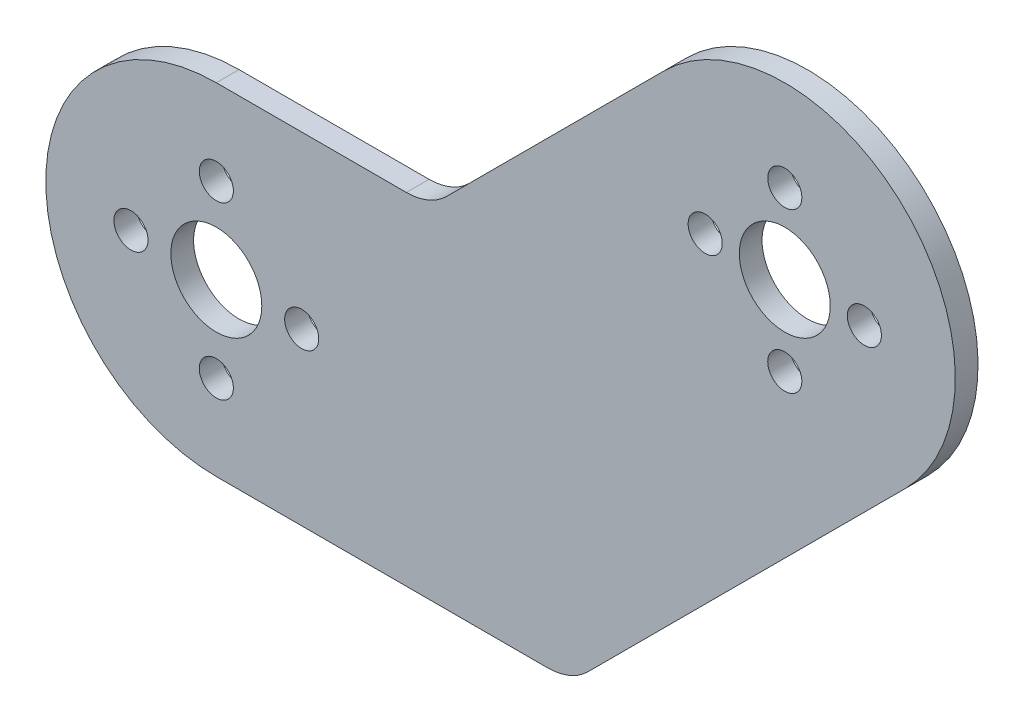
ISO-10303-21;
HEADER;
FILE_DESCRIPTION(('STEP AP214'),'2;1');
FILE_NAME('part.step','',(''),(''),'','','');
FILE_SCHEMA(('AUTOMOTIVE_DESIGN { 1 0 10303 214 1 1 1 1 }'));
ENDSEC;
DATA;
#1=APPLICATION_CONTEXT('core data for automotive mechanical design processes');
#2=APPLICATION_PROTOCOL_DEFINITION('international standard','automotive_design',2000,#1);
#3=PRODUCT_CONTEXT('',#1,'mechanical');
#4=PRODUCT('Part','Part','',(#3));
#5=PRODUCT_RELATED_PRODUCT_CATEGORY('part','',(#4));
#6=PRODUCT_DEFINITION_FORMATION('','',#4);
#7=PRODUCT_DEFINITION_CONTEXT('part definition',#1,'design');
#8=PRODUCT_DEFINITION('design','',#6,#7);
#9=PRODUCT_DEFINITION_SHAPE('','',#8);
#10=(LENGTH_UNIT() NAMED_UNIT(*) SI_UNIT(.MILLI.,.METRE.));
#11=(NAMED_UNIT(*) PLANE_ANGLE_UNIT() SI_UNIT($,.RADIAN.));
#12=(NAMED_UNIT(*) SI_UNIT($,.STERADIAN.) SOLID_ANGLE_UNIT());
#13=UNCERTAINTY_MEASURE_WITH_UNIT(LENGTH_MEASURE(1.E-05),#10,'distance_accuracy_value','');
#14=(GEOMETRIC_REPRESENTATION_CONTEXT(3) GLOBAL_UNCERTAINTY_ASSIGNED_CONTEXT((#13)) GLOBAL_UNIT_ASSIGNED_CONTEXT((#10,
#11,#12)) REPRESENTATION_CONTEXT('',''));
#15=CARTESIAN_POINT('',(0.,0.,0.));
#16=DIRECTION('',(0.,0.,1.));
#17=DIRECTION('',(1.,0.,0.));
#18=AXIS2_PLACEMENT_3D('',#15,#16,#17);
#19=CARTESIAN_POINT('',(0.,0.,2.));
#20=DIRECTION('',(0.,0.,1.));
#21=DIRECTION('',(1.,0.,0.));
#22=AXIS2_PLACEMENT_3D('',#19,#20,#21);
#23=PLANE('',#22);
#24=CARTESIAN_POINT('',(56.9999999995242,24.9999999995243,2.));
#25=DIRECTION('',(0.,0.,1.));
#26=DIRECTION('',(0.,-1.,0.));
#27=AXIS2_PLACEMENT_3D('',#24,#25,#26);
#28=CIRCLE('',#27,1.5);
#29=CARTESIAN_POINT('',(56.9999999995243,23.4999999995243,2.));
#30=VERTEX_POINT('',#29);
#31=EDGE_CURVE('E232',#30,#30,#28,.T.);
#32=ORIENTED_EDGE('',*,*,#31,.F.);
#33=EDGE_LOOP('',(#32));
#34=FACE_BOUND('',#33,.T.);
#35=CARTESIAN_POINT('',(49.9999999995242,17.9999999995242,2.));
#36=DIRECTION('',(0.,0.,1.));
#37=DIRECTION('',(-1.,0.,0.));
#38=AXIS2_PLACEMENT_3D('',#35,#36,#37);
#39=CIRCLE('',#38,1.5);
#40=CARTESIAN_POINT('',(48.4999999995242,17.9999999995242,2.));
#41=VERTEX_POINT('',#40);
#42=EDGE_CURVE('E226',#41,#41,#39,.T.);
#43=ORIENTED_EDGE('',*,*,#42,.F.);
#44=EDGE_LOOP('',(#43));
#45=FACE_BOUND('',#44,.T.);
#46=CARTESIAN_POINT('',(42.9999999995242,24.9999999995242,2.));
#47=DIRECTION('',(0.,0.,1.));
#48=DIRECTION('',(0.,1.,0.));
#49=AXIS2_PLACEMENT_3D('',#46,#47,#48);
#50=CIRCLE('',#49,1.5);
#51=CARTESIAN_POINT('',(42.9999999995242,26.4999999995242,2.));
#52=VERTEX_POINT('',#51);
#53=EDGE_CURVE('E220',#52,#52,#50,.T.);
#54=ORIENTED_EDGE('',*,*,#53,.F.);
#55=EDGE_LOOP('',(#54));
#56=FACE_BOUND('',#55,.T.);
#57=CARTESIAN_POINT('',(49.9999999995242,31.9999999995242,2.));
#58=DIRECTION('',(0.,0.,1.));
#59=DIRECTION('',(1.,0.,0.));
#60=AXIS2_PLACEMENT_3D('',#57,#58,#59);
#61=CIRCLE('',#60,1.5);
#62=CARTESIAN_POINT('',(51.4999999995242,31.9999999995242,2.));
#63=VERTEX_POINT('',#62);
#64=EDGE_CURVE('E214',#63,#63,#61,.T.);
#65=ORIENTED_EDGE('',*,*,#64,.F.);
#66=EDGE_LOOP('',(#65));
#67=FACE_BOUND('',#66,.T.);
#68=CARTESIAN_POINT('',(49.9999999995242,24.9999999995242,2.));
#69=DIRECTION('',(0.,0.,1.));
#70=DIRECTION('',(1.,0.,0.));
#71=AXIS2_PLACEMENT_3D('',#68,#69,#70);
#72=CIRCLE('',#71,3.99999999999999);
#73=CARTESIAN_POINT('',(53.9999999995242,24.9999999995242,2.));
#74=VERTEX_POINT('',#73);
#75=EDGE_CURVE('E208',#74,#74,#72,.T.);
#76=ORIENTED_EDGE('',*,*,#75,.F.);
#77=EDGE_LOOP('',(#76));
#78=FACE_BOUND('',#77,.T.);
#79=CARTESIAN_POINT('',(0.,-7.50979876784262,2.));
#80=DIRECTION('',(0.,0.,1.));
#81=DIRECTION('',(-1.,0.,0.));
#82=AXIS2_PLACEMENT_3D('',#79,#80,#81);
#83=CIRCLE('',#82,1.5);
#84=CARTESIAN_POINT('',(-1.5,-7.50979876784262,2.));
#85=VERTEX_POINT('',#84);
#86=EDGE_CURVE('E193',#85,#85,#83,.T.);
#87=ORIENTED_EDGE('',*,*,#86,.F.);
#88=EDGE_LOOP('',(#87));
#89=FACE_BOUND('',#88,.T.);
#90=CARTESIAN_POINT('',(0.,7.50979876784262,2.));
#91=DIRECTION('',(0.,0.,1.));
#92=DIRECTION('',(1.,0.,0.));
#93=AXIS2_PLACEMENT_3D('',#90,#91,#92);
#94=CIRCLE('',#93,1.5);
#95=CARTESIAN_POINT('',(1.5,7.50979876784262,2.));
#96=VERTEX_POINT('',#95);
#97=EDGE_CURVE('E181',#96,#96,#94,.T.);
#98=ORIENTED_EDGE('',*,*,#97,.F.);
#99=EDGE_LOOP('',(#98));
#100=FACE_BOUND('',#99,.T.);
#101=CARTESIAN_POINT('',(0.,0.,2.));
#102=DIRECTION('',(0.,0.,1.));
#103=DIRECTION('',(1.,0.,0.));
#104=AXIS2_PLACEMENT_3D('',#101,#102,#103);
#105=CIRCLE('',#104,15.);
#106=CARTESIAN_POINT('',(0.,15.,2.));
#107=VERTEX_POINT('',#106);
#108=CARTESIAN_POINT('',(0.,-15.,2.));
#109=VERTEX_POINT('',#108);
#110=EDGE_CURVE('E144',#107,#109,#105,.T.);
#111=ORIENTED_EDGE('',*,*,#110,.T.);
#112=DIRECTION('',(1.,0.,0.));
#113=VECTOR('',#112,1.);
#114=CARTESIAN_POINT('',(29.1421356237315,-15.0000000000001,2.));
#115=LINE('',#114,#113);
#116=CARTESIAN_POINT('',(29.1421356237315,-15.0000000000001,2.));
#117=VERTEX_POINT('',#116);
#118=EDGE_CURVE('E92',#109,#117,#115,.T.);
#119=ORIENTED_EDGE('',*,*,#118,.T.);
#120=CARTESIAN_POINT('',(29.1421356237316,-10.0000000000001,2.));
#121=DIRECTION('',(0.,0.,1.));
#122=DIRECTION('',(-1.,0.,0.));
#123=AXIS2_PLACEMENT_3D('',#120,#121,#122);
#124=CIRCLE('',#123,4.99999999999996);
#125=CARTESIAN_POINT('',(32.6776695296644,-13.5355339059327,2.));
#126=VERTEX_POINT('',#125);
#127=EDGE_CURVE('E159',#117,#126,#124,.T.);
#128=ORIENTED_EDGE('',*,*,#127,.T.);
#129=DIRECTION('',(0.707106781186539,0.707106781186556,0.));
#130=VECTOR('',#129,1.);
#131=CARTESIAN_POINT('',(60.6066017173227,14.3933982817263,2.));
#132=LINE('',#131,#130);
#133=CARTESIAN_POINT('',(60.6066017173227,14.3933982817263,2.));
#134=VERTEX_POINT('',#133);
#135=EDGE_CURVE('E172',#126,#134,#132,.T.);
#136=ORIENTED_EDGE('',*,*,#135,.T.);
#137=CARTESIAN_POINT('',(49.9999999995244,24.9999999995244,2.));
#138=DIRECTION('',(0.,0.,1.));
#139=DIRECTION('',(-1.,0.,0.));
#140=AXIS2_PLACEMENT_3D('',#137,#138,#139);
#141=CIRCLE('',#140,15.);
#142=CARTESIAN_POINT('',(39.393398281726,35.6066017173225,2.));
#143=VERTEX_POINT('',#142);
#144=EDGE_CURVE('E111',#134,#143,#141,.T.);
#145=ORIENTED_EDGE('',*,*,#144,.T.);
#146=DIRECTION('',(-0.707106781186539,-0.707106781186556,0.));
#147=VECTOR('',#146,1.);
#148=CARTESIAN_POINT('',(20.2512626584713,16.4644660940672,2.));
#149=LINE('',#148,#147);
#150=CARTESIAN_POINT('',(20.2512626584713,16.4644660940672,2.));
#151=VERTEX_POINT('',#150);
#152=EDGE_CURVE('E105',#143,#151,#149,.T.);
#153=ORIENTED_EDGE('',*,*,#152,.T.);
#154=CARTESIAN_POINT('',(16.7157287525385,19.9999999999999,2.));
#155=DIRECTION('',(0.,0.,-1.));
#156=DIRECTION('',(1.,0.,0.));
#157=AXIS2_PLACEMENT_3D('',#154,#155,#156);
#158=CIRCLE('',#157,5.);
#159=CARTESIAN_POINT('',(16.7157287525385,14.9999999999999,2.));
#160=VERTEX_POINT('',#159);
#161=EDGE_CURVE('E109',#151,#160,#158,.T.);
#162=ORIENTED_EDGE('',*,*,#161,.T.);
#163=DIRECTION('',(-1.,0.,0.));
#164=VECTOR('',#163,1.);
#165=CARTESIAN_POINT('',(0.,15.,2.));
#166=LINE('',#165,#164);
#167=EDGE_CURVE('E49',#160,#107,#166,.T.);
#168=ORIENTED_EDGE('',*,*,#167,.T.);
#169=EDGE_LOOP('',(#111,#119,#128,#136,#145,#153,#162,#168));
#170=FACE_BOUND('',#169,.T.);
#171=CARTESIAN_POINT('',(0.,0.,2.));
#172=DIRECTION('',(0.,0.,1.));
#173=DIRECTION('',(1.,0.,0.));
#174=AXIS2_PLACEMENT_3D('',#171,#172,#173);
#175=CIRCLE('',#174,4.);
#176=CARTESIAN_POINT('',(4.,0.,2.));
#177=VERTEX_POINT('',#176);
#178=EDGE_CURVE('E133',#177,#177,#175,.T.);
#179=ORIENTED_EDGE('',*,*,#178,.F.);
#180=EDGE_LOOP('',(#179));
#181=FACE_BOUND('',#180,.T.);
#182=CARTESIAN_POINT('',(-7.50979876784262,0.,2.));
#183=DIRECTION('',(0.,0.,1.));
#184=DIRECTION('',(0.,1.,0.));
#185=AXIS2_PLACEMENT_3D('',#182,#183,#184);
#186=CIRCLE('',#185,1.5);
#187=CARTESIAN_POINT('',(-7.50979876784262,1.49999999999997,2.));
#188=VERTEX_POINT('',#187);
#189=EDGE_CURVE('E187',#188,#188,#186,.T.);
#190=ORIENTED_EDGE('',*,*,#189,.F.);
#191=EDGE_LOOP('',(#190));
#192=FACE_BOUND('',#191,.T.);
#193=CARTESIAN_POINT('',(7.50979876784262,0.,2.));
#194=DIRECTION('',(0.,0.,1.));
#195=DIRECTION('',(0.,-1.,0.));
#196=AXIS2_PLACEMENT_3D('',#193,#194,#195);
#197=CIRCLE('',#196,1.5);
#198=CARTESIAN_POINT('',(7.50979876784263,-1.49999999999992,2.));
#199=VERTEX_POINT('',#198);
#200=EDGE_CURVE('E199',#199,#199,#197,.T.);
#201=ORIENTED_EDGE('',*,*,#200,.F.);
#202=EDGE_LOOP('',(#201));
#203=FACE_BOUND('',#202,.T.);
#204=ADVANCED_FACE('F32',(#34,#45,#56,#67,#78,#89,#100,#170,#181,#192,#203),#23,.T.);
#205=CARTESIAN_POINT('',(0.,0.,0.));
#206=DIRECTION('',(0.,0.,1.));
#207=DIRECTION('',(1.,0.,0.));
#208=AXIS2_PLACEMENT_3D('',#205,#206,#207);
#209=PLANE('',#208);
#210=CARTESIAN_POINT('',(56.9999999995242,24.9999999995243,0.));
#211=DIRECTION('',(0.,0.,1.));
#212=DIRECTION('',(0.,-1.,0.));
#213=AXIS2_PLACEMENT_3D('',#210,#211,#212);
#214=CIRCLE('',#213,1.5);
#215=CARTESIAN_POINT('',(56.9999999995243,23.4999999995243,0.));
#216=VERTEX_POINT('',#215);
#217=EDGE_CURVE('E229',#216,#216,#214,.T.);
#218=ORIENTED_EDGE('',*,*,#217,.T.);
#219=EDGE_LOOP('',(#218));
#220=FACE_BOUND('',#219,.T.);
#221=CARTESIAN_POINT('',(49.9999999995242,17.9999999995242,0.));
#222=DIRECTION('',(0.,0.,1.));
#223=DIRECTION('',(-1.,0.,0.));
#224=AXIS2_PLACEMENT_3D('',#221,#222,#223);
#225=CIRCLE('',#224,1.5);
#226=CARTESIAN_POINT('',(48.4999999995242,17.9999999995242,0.));
#227=VERTEX_POINT('',#226);
#228=EDGE_CURVE('E223',#227,#227,#225,.T.);
#229=ORIENTED_EDGE('',*,*,#228,.T.);
#230=EDGE_LOOP('',(#229));
#231=FACE_BOUND('',#230,.T.);
#232=CARTESIAN_POINT('',(42.9999999995242,24.9999999995242,0.));
#233=DIRECTION('',(0.,0.,1.));
#234=DIRECTION('',(0.,1.,0.));
#235=AXIS2_PLACEMENT_3D('',#232,#233,#234);
#236=CIRCLE('',#235,1.5);
#237=CARTESIAN_POINT('',(42.9999999995242,26.4999999995242,0.));
#238=VERTEX_POINT('',#237);
#239=EDGE_CURVE('E217',#238,#238,#236,.T.);
#240=ORIENTED_EDGE('',*,*,#239,.T.);
#241=EDGE_LOOP('',(#240));
#242=FACE_BOUND('',#241,.T.);
#243=CARTESIAN_POINT('',(49.9999999995242,31.9999999995242,0.));
#244=DIRECTION('',(0.,0.,1.));
#245=DIRECTION('',(1.,0.,0.));
#246=AXIS2_PLACEMENT_3D('',#243,#244,#245);
#247=CIRCLE('',#246,1.5);
#248=CARTESIAN_POINT('',(51.4999999995242,31.9999999995242,0.));
#249=VERTEX_POINT('',#248);
#250=EDGE_CURVE('E211',#249,#249,#247,.T.);
#251=ORIENTED_EDGE('',*,*,#250,.T.);
#252=EDGE_LOOP('',(#251));
#253=FACE_BOUND('',#252,.T.);
#254=CARTESIAN_POINT('',(49.9999999995242,24.9999999995242,0.));
#255=DIRECTION('',(0.,0.,1.));
#256=DIRECTION('',(1.,0.,0.));
#257=AXIS2_PLACEMENT_3D('',#254,#255,#256);
#258=CIRCLE('',#257,3.99999999999999);
#259=CARTESIAN_POINT('',(53.9999999995242,24.9999999995242,0.));
#260=VERTEX_POINT('',#259);
#261=EDGE_CURVE('E205',#260,#260,#258,.T.);
#262=ORIENTED_EDGE('',*,*,#261,.T.);
#263=EDGE_LOOP('',(#262));
#264=FACE_BOUND('',#263,.T.);
#265=CARTESIAN_POINT('',(0.,-7.50979876784262,0.));
#266=DIRECTION('',(0.,0.,1.));
#267=DIRECTION('',(-1.,0.,0.));
#268=AXIS2_PLACEMENT_3D('',#265,#266,#267);
#269=CIRCLE('',#268,1.5);
#270=CARTESIAN_POINT('',(-1.5,-7.50979876784262,0.));
#271=VERTEX_POINT('',#270);
#272=EDGE_CURVE('E196',#271,#271,#269,.T.);
#273=ORIENTED_EDGE('',*,*,#272,.T.);
#274=EDGE_LOOP('',(#273));
#275=FACE_BOUND('',#274,.T.);
#276=CARTESIAN_POINT('',(0.,7.50979876784262,0.));
#277=DIRECTION('',(0.,0.,1.));
#278=DIRECTION('',(1.,0.,0.));
#279=AXIS2_PLACEMENT_3D('',#276,#277,#278);
#280=CIRCLE('',#279,1.5);
#281=CARTESIAN_POINT('',(1.5,7.50979876784262,0.));
#282=VERTEX_POINT('',#281);
#283=EDGE_CURVE('E184',#282,#282,#280,.T.);
#284=ORIENTED_EDGE('',*,*,#283,.T.);
#285=EDGE_LOOP('',(#284));
#286=FACE_BOUND('',#285,.T.);
#287=CARTESIAN_POINT('',(0.,0.,0.));
#288=DIRECTION('',(0.,0.,1.));
#289=DIRECTION('',(1.,0.,0.));
#290=AXIS2_PLACEMENT_3D('',#287,#288,#289);
#291=CIRCLE('',#290,15.);
#292=CARTESIAN_POINT('',(0.,15.,0.));
#293=VERTEX_POINT('',#292);
#294=CARTESIAN_POINT('',(0.,-15.,0.));
#295=VERTEX_POINT('',#294);
#296=EDGE_CURVE('E129',#293,#295,#291,.T.);
#297=ORIENTED_EDGE('',*,*,#296,.F.);
#298=DIRECTION('',(-1.,0.,0.));
#299=VECTOR('',#298,1.);
#300=CARTESIAN_POINT('',(0.,15.,0.));
#301=LINE('',#300,#299);
#302=CARTESIAN_POINT('',(16.7157287525385,14.9999999999999,0.));
#303=VERTEX_POINT('',#302);
#304=EDGE_CURVE('E84',#303,#293,#301,.T.);
#305=ORIENTED_EDGE('',*,*,#304,.F.);
#306=CARTESIAN_POINT('',(16.7157287525385,19.9999999999999,0.));
#307=DIRECTION('',(0.,0.,-1.));
#308=DIRECTION('',(1.,0.,0.));
#309=AXIS2_PLACEMENT_3D('',#306,#307,#308);
#310=CIRCLE('',#309,5.);
#311=CARTESIAN_POINT('',(20.2512626584713,16.4644660940672,0.));
#312=VERTEX_POINT('',#311);
#313=EDGE_CURVE('E78',#312,#303,#310,.T.);
#314=ORIENTED_EDGE('',*,*,#313,.F.);
#315=DIRECTION('',(-0.707106781186539,-0.707106781186556,0.));
#316=VECTOR('',#315,1.);
#317=CARTESIAN_POINT('',(20.2512626584713,16.4644660940672,0.));
#318=LINE('',#317,#316);
#319=CARTESIAN_POINT('',(39.393398281726,35.6066017173225,0.));
#320=VERTEX_POINT('',#319);
#321=EDGE_CURVE('E119',#320,#312,#318,.T.);
#322=ORIENTED_EDGE('',*,*,#321,.F.);
#323=CARTESIAN_POINT('',(49.9999999995244,24.9999999995244,0.));
#324=DIRECTION('',(0.,0.,1.));
#325=DIRECTION('',(-1.,0.,0.));
#326=AXIS2_PLACEMENT_3D('',#323,#324,#325);
#327=CIRCLE('',#326,15.);
#328=CARTESIAN_POINT('',(60.6066017173227,14.3933982817263,0.));
#329=VERTEX_POINT('',#328);
#330=EDGE_CURVE('E139',#329,#320,#327,.T.);
#331=ORIENTED_EDGE('',*,*,#330,.F.);
#332=DIRECTION('',(0.707106781186539,0.707106781186556,0.));
#333=VECTOR('',#332,1.);
#334=CARTESIAN_POINT('',(60.6066017173227,14.3933982817263,0.));
#335=LINE('',#334,#333);
#336=CARTESIAN_POINT('',(32.6776695296644,-13.5355339059327,0.));
#337=VERTEX_POINT('',#336);
#338=EDGE_CURVE('E137',#337,#329,#335,.T.);
#339=ORIENTED_EDGE('',*,*,#338,.F.);
#340=CARTESIAN_POINT('',(29.1421356237316,-10.0000000000001,0.));
#341=DIRECTION('',(0.,0.,1.));
#342=DIRECTION('',(-1.,0.,0.));
#343=AXIS2_PLACEMENT_3D('',#340,#341,#342);
#344=CIRCLE('',#343,4.99999999999996);
#345=CARTESIAN_POINT('',(29.1421356237315,-15.0000000000001,0.));
#346=VERTEX_POINT('',#345);
#347=EDGE_CURVE('E135',#346,#337,#344,.T.);
#348=ORIENTED_EDGE('',*,*,#347,.F.);
#349=DIRECTION('',(1.,0.,0.));
#350=VECTOR('',#349,1.);
#351=CARTESIAN_POINT('',(29.1421356237315,-15.0000000000001,0.));
#352=LINE('',#351,#350);
#353=EDGE_CURVE('E132',#295,#346,#352,.T.);
#354=ORIENTED_EDGE('',*,*,#353,.F.);
#355=EDGE_LOOP('',(#297,#305,#314,#322,#331,#339,#348,#354));
#356=FACE_BOUND('',#355,.T.);
#357=CARTESIAN_POINT('',(0.,0.,0.));
#358=DIRECTION('',(0.,0.,1.));
#359=DIRECTION('',(1.,0.,0.));
#360=AXIS2_PLACEMENT_3D('',#357,#358,#359);
#361=CIRCLE('',#360,4.);
#362=CARTESIAN_POINT('',(4.,0.,0.));
#363=VERTEX_POINT('',#362);
#364=EDGE_CURVE('E178',#363,#363,#361,.T.);
#365=ORIENTED_EDGE('',*,*,#364,.T.);
#366=EDGE_LOOP('',(#365));
#367=FACE_BOUND('',#366,.T.);
#368=CARTESIAN_POINT('',(-7.50979876784262,0.,0.));
#369=DIRECTION('',(0.,0.,1.));
#370=DIRECTION('',(0.,1.,0.));
#371=AXIS2_PLACEMENT_3D('',#368,#369,#370);
#372=CIRCLE('',#371,1.5);
#373=CARTESIAN_POINT('',(-7.50979876784262,1.49999999999997,0.));
#374=VERTEX_POINT('',#373);
#375=EDGE_CURVE('E190',#374,#374,#372,.T.);
#376=ORIENTED_EDGE('',*,*,#375,.T.);
#377=EDGE_LOOP('',(#376));
#378=FACE_BOUND('',#377,.T.);
#379=CARTESIAN_POINT('',(7.50979876784262,0.,0.));
#380=DIRECTION('',(0.,0.,1.));
#381=DIRECTION('',(0.,-1.,0.));
#382=AXIS2_PLACEMENT_3D('',#379,#380,#381);
#383=CIRCLE('',#382,1.5);
#384=CARTESIAN_POINT('',(7.50979876784263,-1.49999999999992,0.));
#385=VERTEX_POINT('',#384);
#386=EDGE_CURVE('E202',#385,#385,#383,.T.);
#387=ORIENTED_EDGE('',*,*,#386,.T.);
#388=EDGE_LOOP('',(#387));
#389=FACE_BOUND('',#388,.T.);
#390=ADVANCED_FACE('F163',(#220,#231,#242,#253,#264,#275,#286,#356,#367,#378,#389),#209,.F.);
#391=CARTESIAN_POINT('',(0.,0.,2.));
#392=DIRECTION('',(0.,0.,-1.));
#393=DIRECTION('',(-1.,0.,0.));
#394=AXIS2_PLACEMENT_3D('',#391,#392,#393);
#395=CYLINDRICAL_SURFACE('',#394,15.);
#396=ORIENTED_EDGE('',*,*,#296,.T.);
#397=DIRECTION('',(0.,0.,-1.));
#398=VECTOR('',#397,1.);
#399=CARTESIAN_POINT('',(0.,-15.,2.));
#400=LINE('',#399,#398);
#401=EDGE_CURVE('E11',#109,#295,#400,.T.);
#402=ORIENTED_EDGE('',*,*,#401,.F.);
#403=ORIENTED_EDGE('',*,*,#110,.F.);
#404=DIRECTION('',(0.,0.,-1.));
#405=VECTOR('',#404,1.);
#406=CARTESIAN_POINT('',(0.,15.,2.));
#407=LINE('',#406,#405);
#408=EDGE_CURVE('E125',#107,#293,#407,.T.);
#409=ORIENTED_EDGE('',*,*,#408,.T.);
#410=EDGE_LOOP('',(#396,#402,#403,#409));
#411=FACE_BOUND('',#410,.T.);
#412=ADVANCED_FACE('F34',(#411),#395,.T.);
#413=CARTESIAN_POINT('',(29.1421356237315,-15.0000000000001,2.));
#414=DIRECTION('',(0.,1.,0.));
#415=DIRECTION('',(-1.,0.,0.));
#416=AXIS2_PLACEMENT_3D('',#413,#414,#415);
#417=PLANE('',#416);
#418=ORIENTED_EDGE('',*,*,#353,.T.);
#419=DIRECTION('',(0.,0.,-1.));
#420=VECTOR('',#419,1.);
#421=CARTESIAN_POINT('',(29.1421356237315,-15.0000000000001,2.));
#422=LINE('',#421,#420);
#423=EDGE_CURVE('E41',#117,#346,#422,.T.);
#424=ORIENTED_EDGE('',*,*,#423,.F.);
#425=ORIENTED_EDGE('',*,*,#118,.F.);
#426=ORIENTED_EDGE('',*,*,#401,.T.);
#427=EDGE_LOOP('',(#418,#424,#425,#426));
#428=FACE_BOUND('',#427,.T.);
#429=ADVANCED_FACE('F275',(#428),#417,.F.);
#430=CARTESIAN_POINT('',(29.1421356237316,-10.0000000000001,2.));
#431=DIRECTION('',(0.,0.,-1.));
#432=DIRECTION('',(-1.,0.,0.));
#433=AXIS2_PLACEMENT_3D('',#430,#431,#432);
#434=CYLINDRICAL_SURFACE('',#433,4.99999999999996);
#435=ORIENTED_EDGE('',*,*,#347,.T.);
#436=DIRECTION('',(0.,0.,-1.));
#437=VECTOR('',#436,1.);
#438=CARTESIAN_POINT('',(32.6776695296644,-13.5355339059327,2.));
#439=LINE('',#438,#437);
#440=EDGE_CURVE('E151',#126,#337,#439,.T.);
#441=ORIENTED_EDGE('',*,*,#440,.F.);
#442=ORIENTED_EDGE('',*,*,#127,.F.);
#443=ORIENTED_EDGE('',*,*,#423,.T.);
#444=EDGE_LOOP('',(#435,#441,#442,#443));
#445=FACE_BOUND('',#444,.T.);
#446=ADVANCED_FACE('F157',(#445),#434,.T.);
#447=CARTESIAN_POINT('',(60.6066017173227,14.3933982817263,2.));
#448=DIRECTION('',(-0.707106781186556,0.707106781186539,0.));
#449=DIRECTION('',(-0.707106781186539,-0.707106781186556,0.));
#450=AXIS2_PLACEMENT_3D('',#447,#448,#449);
#451=PLANE('',#450);
#452=ORIENTED_EDGE('',*,*,#338,.T.);
#453=DIRECTION('',(0.,0.,-1.));
#454=VECTOR('',#453,1.);
#455=CARTESIAN_POINT('',(60.6066017173227,14.3933982817263,2.));
#456=LINE('',#455,#454);
#457=EDGE_CURVE('E148',#134,#329,#456,.T.);
#458=ORIENTED_EDGE('',*,*,#457,.F.);
#459=ORIENTED_EDGE('',*,*,#135,.F.);
#460=ORIENTED_EDGE('',*,*,#440,.T.);
#461=EDGE_LOOP('',(#452,#458,#459,#460));
#462=FACE_BOUND('',#461,.T.);
#463=ADVANCED_FACE('F168',(#462),#451,.F.);
#464=CARTESIAN_POINT('',(49.9999999995244,24.9999999995244,2.));
#465=DIRECTION('',(0.,0.,-1.));
#466=DIRECTION('',(-1.,0.,0.));
#467=AXIS2_PLACEMENT_3D('',#464,#465,#466);
#468=CYLINDRICAL_SURFACE('',#467,15.);
#469=ORIENTED_EDGE('',*,*,#330,.T.);
#470=DIRECTION('',(0.,0.,-1.));
#471=VECTOR('',#470,1.);
#472=CARTESIAN_POINT('',(39.393398281726,35.6066017173225,2.));
#473=LINE('',#472,#471);
#474=EDGE_CURVE('E120',#143,#320,#473,.T.);
#475=ORIENTED_EDGE('',*,*,#474,.F.);
#476=ORIENTED_EDGE('',*,*,#144,.F.);
#477=ORIENTED_EDGE('',*,*,#457,.T.);
#478=EDGE_LOOP('',(#469,#475,#476,#477));
#479=FACE_BOUND('',#478,.T.);
#480=ADVANCED_FACE('F171',(#479),#468,.T.);
#481=CARTESIAN_POINT('',(20.2512626584713,16.4644660940672,2.));
#482=DIRECTION('',(0.707106781186556,-0.707106781186539,0.));
#483=DIRECTION('',(0.707106781186539,0.707106781186556,0.));
#484=AXIS2_PLACEMENT_3D('',#481,#482,#483);
#485=PLANE('',#484);
#486=ORIENTED_EDGE('',*,*,#321,.T.);
#487=DIRECTION('',(0.,0.,-1.));
#488=VECTOR('',#487,1.);
#489=CARTESIAN_POINT('',(20.2512626584713,16.4644660940672,2.));
#490=LINE('',#489,#488);
#491=EDGE_CURVE('E116',#151,#312,#490,.T.);
#492=ORIENTED_EDGE('',*,*,#491,.F.);
#493=ORIENTED_EDGE('',*,*,#152,.F.);
#494=ORIENTED_EDGE('',*,*,#474,.T.);
#495=EDGE_LOOP('',(#486,#492,#493,#494));
#496=FACE_BOUND('',#495,.T.);
#497=ADVANCED_FACE('F117',(#496),#485,.F.);
#498=CARTESIAN_POINT('',(16.7157287525385,19.9999999999999,2.));
#499=DIRECTION('',(0.,0.,-1.));
#500=DIRECTION('',(-1.,0.,0.));
#501=AXIS2_PLACEMENT_3D('',#498,#499,#500);
#502=CYLINDRICAL_SURFACE('',#501,5.);
#503=ORIENTED_EDGE('',*,*,#313,.T.);
#504=DIRECTION('',(0.,0.,-1.));
#505=VECTOR('',#504,1.);
#506=CARTESIAN_POINT('',(16.7157287525385,14.9999999999999,2.));
#507=LINE('',#506,#505);
#508=EDGE_CURVE('E121',#160,#303,#507,.T.);
#509=ORIENTED_EDGE('',*,*,#508,.F.);
#510=ORIENTED_EDGE('',*,*,#161,.F.);
#511=ORIENTED_EDGE('',*,*,#491,.T.);
#512=EDGE_LOOP('',(#503,#509,#510,#511));
#513=FACE_BOUND('',#512,.T.);
#514=ADVANCED_FACE('F123',(#513),#502,.F.);
#515=CARTESIAN_POINT('',(0.,15.,2.));
#516=DIRECTION('',(0.,-1.,0.));
#517=DIRECTION('',(1.,0.,0.));
#518=AXIS2_PLACEMENT_3D('',#515,#516,#517);
#519=PLANE('',#518);
#520=ORIENTED_EDGE('',*,*,#304,.T.);
#521=ORIENTED_EDGE('',*,*,#408,.F.);
#522=ORIENTED_EDGE('',*,*,#167,.F.);
#523=ORIENTED_EDGE('',*,*,#508,.T.);
#524=EDGE_LOOP('',(#520,#521,#522,#523));
#525=FACE_BOUND('',#524,.T.);
#526=ADVANCED_FACE('F279',(#525),#519,.F.);
#527=CARTESIAN_POINT('',(0.,0.,2.));
#528=DIRECTION('',(0.,0.,-1.));
#529=DIRECTION('',(-1.,0.,0.));
#530=AXIS2_PLACEMENT_3D('',#527,#528,#529);
#531=CYLINDRICAL_SURFACE('',#530,4.);
#532=ORIENTED_EDGE('',*,*,#178,.T.);
#533=EDGE_LOOP('',(#532));
#534=FACE_BOUND('',#533,.T.);
#535=ORIENTED_EDGE('',*,*,#364,.F.);
#536=EDGE_LOOP('',(#535));
#537=FACE_BOUND('',#536,.T.);
#538=ADVANCED_FACE('F266',(#534,#537),#531,.F.);
#539=CARTESIAN_POINT('',(0.,7.50979876784262,2.));
#540=DIRECTION('',(0.,0.,-1.));
#541=DIRECTION('',(-1.,0.,0.));
#542=AXIS2_PLACEMENT_3D('',#539,#540,#541);
#543=CYLINDRICAL_SURFACE('',#542,1.5);
#544=ORIENTED_EDGE('',*,*,#97,.T.);
#545=EDGE_LOOP('',(#544));
#546=FACE_BOUND('',#545,.T.);
#547=ORIENTED_EDGE('',*,*,#283,.F.);
#548=EDGE_LOOP('',(#547));
#549=FACE_BOUND('',#548,.T.);
#550=ADVANCED_FACE('F262',(#546,#549),#543,.F.);
#551=CARTESIAN_POINT('',(-7.50979876784262,0.,2.));
#552=DIRECTION('',(0.,0.,-1.));
#553=DIRECTION('',(-1.,0.,0.));
#554=AXIS2_PLACEMENT_3D('',#551,#552,#553);
#555=CYLINDRICAL_SURFACE('',#554,1.5);
#556=ORIENTED_EDGE('',*,*,#189,.T.);
#557=EDGE_LOOP('',(#556));
#558=FACE_BOUND('',#557,.T.);
#559=ORIENTED_EDGE('',*,*,#375,.F.);
#560=EDGE_LOOP('',(#559));
#561=FACE_BOUND('',#560,.T.);
#562=ADVANCED_FACE('F265',(#558,#561),#555,.F.);
#563=CARTESIAN_POINT('',(0.,-7.50979876784262,2.));
#564=DIRECTION('',(0.,0.,-1.));
#565=DIRECTION('',(-1.,0.,0.));
#566=AXIS2_PLACEMENT_3D('',#563,#564,#565);
#567=CYLINDRICAL_SURFACE('',#566,1.5);
#568=ORIENTED_EDGE('',*,*,#86,.T.);
#569=EDGE_LOOP('',(#568));
#570=FACE_BOUND('',#569,.T.);
#571=ORIENTED_EDGE('',*,*,#272,.F.);
#572=EDGE_LOOP('',(#571));
#573=FACE_BOUND('',#572,.T.);
#574=ADVANCED_FACE('F338',(#570,#573),#567,.F.);
#575=CARTESIAN_POINT('',(7.50979876784262,0.,2.));
#576=DIRECTION('',(0.,0.,-1.));
#577=DIRECTION('',(-1.,0.,0.));
#578=AXIS2_PLACEMENT_3D('',#575,#576,#577);
#579=CYLINDRICAL_SURFACE('',#578,1.5);
#580=ORIENTED_EDGE('',*,*,#200,.T.);
#581=EDGE_LOOP('',(#580));
#582=FACE_BOUND('',#581,.T.);
#583=ORIENTED_EDGE('',*,*,#386,.F.);
#584=EDGE_LOOP('',(#583));
#585=FACE_BOUND('',#584,.T.);
#586=ADVANCED_FACE('F346',(#582,#585),#579,.F.);
#587=CARTESIAN_POINT('',(49.9999999995242,24.9999999995242,0.));
#588=DIRECTION('',(0.,0.,1.));
#589=DIRECTION('',(1.,0.,0.));
#590=AXIS2_PLACEMENT_3D('',#587,#588,#589);
#591=CYLINDRICAL_SURFACE('',#590,3.99999999999999);
#592=ORIENTED_EDGE('',*,*,#261,.F.);
#593=EDGE_LOOP('',(#592));
#594=FACE_BOUND('',#593,.T.);
#595=ORIENTED_EDGE('',*,*,#75,.T.);
#596=EDGE_LOOP('',(#595));
#597=FACE_BOUND('',#596,.T.);
#598=ADVANCED_FACE('F354',(#594,#597),#591,.F.);
#599=CARTESIAN_POINT('',(49.9999999995242,31.9999999995242,0.));
#600=DIRECTION('',(0.,0.,1.));
#601=DIRECTION('',(1.,0.,0.));
#602=AXIS2_PLACEMENT_3D('',#599,#600,#601);
#603=CYLINDRICAL_SURFACE('',#602,1.5);
#604=ORIENTED_EDGE('',*,*,#250,.F.);
#605=EDGE_LOOP('',(#604));
#606=FACE_BOUND('',#605,.T.);
#607=ORIENTED_EDGE('',*,*,#64,.T.);
#608=EDGE_LOOP('',(#607));
#609=FACE_BOUND('',#608,.T.);
#610=ADVANCED_FACE('F362',(#606,#609),#603,.F.);
#611=CARTESIAN_POINT('',(42.9999999995242,24.9999999995242,0.));
#612=DIRECTION('',(0.,0.,1.));
#613=DIRECTION('',(1.,0.,0.));
#614=AXIS2_PLACEMENT_3D('',#611,#612,#613);
#615=CYLINDRICAL_SURFACE('',#614,1.5);
#616=ORIENTED_EDGE('',*,*,#239,.F.);
#617=EDGE_LOOP('',(#616));
#618=FACE_BOUND('',#617,.T.);
#619=ORIENTED_EDGE('',*,*,#53,.T.);
#620=EDGE_LOOP('',(#619));
#621=FACE_BOUND('',#620,.T.);
#622=ADVANCED_FACE('F370',(#618,#621),#615,.F.);
#623=CARTESIAN_POINT('',(49.9999999995242,17.9999999995242,0.));
#624=DIRECTION('',(0.,0.,1.));
#625=DIRECTION('',(1.,0.,0.));
#626=AXIS2_PLACEMENT_3D('',#623,#624,#625);
#627=CYLINDRICAL_SURFACE('',#626,1.5);
#628=ORIENTED_EDGE('',*,*,#228,.F.);
#629=EDGE_LOOP('',(#628));
#630=FACE_BOUND('',#629,.T.);
#631=ORIENTED_EDGE('',*,*,#42,.T.);
#632=EDGE_LOOP('',(#631));
#633=FACE_BOUND('',#632,.T.);
#634=ADVANCED_FACE('F243',(#630,#633),#627,.F.);
#635=CARTESIAN_POINT('',(56.9999999995242,24.9999999995243,0.));
#636=DIRECTION('',(0.,0.,1.));
#637=DIRECTION('',(1.,0.,0.));
#638=AXIS2_PLACEMENT_3D('',#635,#636,#637);
#639=CYLINDRICAL_SURFACE('',#638,1.5);
#640=ORIENTED_EDGE('',*,*,#217,.F.);
#641=EDGE_LOOP('',(#640));
#642=FACE_BOUND('',#641,.T.);
#643=ORIENTED_EDGE('',*,*,#31,.T.);
#644=EDGE_LOOP('',(#643));
#645=FACE_BOUND('',#644,.T.);
#646=ADVANCED_FACE('F240',(#642,#645),#639,.F.);
#647=CLOSED_SHELL('',(#204,#390,#412,#429,#446,#463,#480,#497,#514,#526,#538,#550,#562,#574,
#586,#598,#610,#622,#634,#646));
#648=MANIFOLD_SOLID_BREP('B2',#647);
#649=ADVANCED_BREP_SHAPE_REPRESENTATION('',(#18,#648),#14);
#650=SHAPE_DEFINITION_REPRESENTATION(#9,#649);
ENDSEC;
END-ISO-10303-21;
